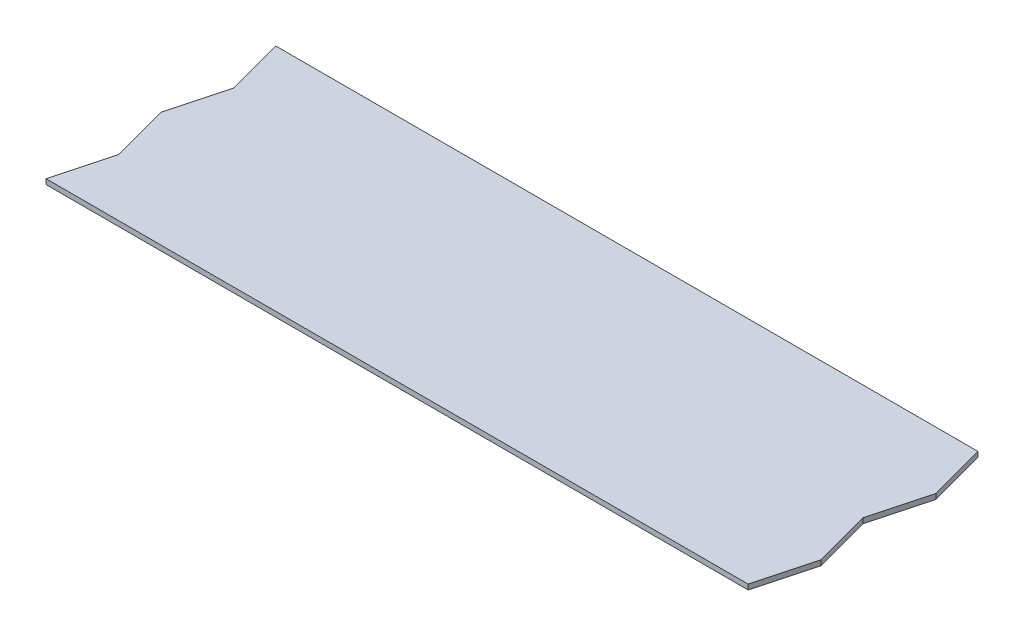
ISO-10303-21;
HEADER;
FILE_DESCRIPTION(('STEP AP214'),'2;1');
FILE_NAME('part.step','',(''),(''),'','','');
FILE_SCHEMA(('AUTOMOTIVE_DESIGN { 1 0 10303 214 1 1 1 1 }'));
ENDSEC;
DATA;
#1=APPLICATION_CONTEXT('core data for automotive mechanical design processes');
#2=APPLICATION_PROTOCOL_DEFINITION('international standard','automotive_design',2000,#1);
#3=PRODUCT_CONTEXT('',#1,'mechanical');
#4=PRODUCT('Part','Part','',(#3));
#5=PRODUCT_RELATED_PRODUCT_CATEGORY('part','',(#4));
#6=PRODUCT_DEFINITION_FORMATION('','',#4);
#7=PRODUCT_DEFINITION_CONTEXT('part definition',#1,'design');
#8=PRODUCT_DEFINITION('design','',#6,#7);
#9=PRODUCT_DEFINITION_SHAPE('','',#8);
#10=(LENGTH_UNIT() NAMED_UNIT(*) SI_UNIT(.MILLI.,.METRE.));
#11=(NAMED_UNIT(*) PLANE_ANGLE_UNIT() SI_UNIT($,.RADIAN.));
#12=(NAMED_UNIT(*) SI_UNIT($,.STERADIAN.) SOLID_ANGLE_UNIT());
#13=UNCERTAINTY_MEASURE_WITH_UNIT(LENGTH_MEASURE(1.E-05),#10,'distance_accuracy_value','');
#14=(GEOMETRIC_REPRESENTATION_CONTEXT(3) GLOBAL_UNCERTAINTY_ASSIGNED_CONTEXT((#13)) GLOBAL_UNIT_ASSIGNED_CONTEXT((#10,
#11,#12)) REPRESENTATION_CONTEXT('',''));
#15=CARTESIAN_POINT('',(0.,0.,0.));
#16=DIRECTION('',(0.,0.,1.));
#17=DIRECTION('',(1.,0.,0.));
#18=AXIS2_PLACEMENT_3D('',#15,#16,#17);
#19=CARTESIAN_POINT('',(0.,0.4,0.));
#20=DIRECTION('',(0.965925826289072,0.,-0.258819045102506));
#21=DIRECTION('',(-0.258819045102506,0.,-0.965925826289072));
#22=AXIS2_PLACEMENT_3D('',#19,#20,#21);
#23=PLANE('',#22);
#24=DIRECTION('',(0.258819045102506,0.,0.965925826289072));
#25=VECTOR('',#24,1.);
#26=CARTESIAN_POINT('',(0.,0.,0.));
#27=LINE('',#26,#25);
#28=CARTESIAN_POINT('',(0.,0.,0.));
#29=VERTEX_POINT('',#28);
#30=CARTESIAN_POINT('',(1.20577136593996,0.,4.49999999999992));
#31=VERTEX_POINT('',#30);
#32=EDGE_CURVE('E147',#29,#31,#27,.T.);
#33=ORIENTED_EDGE('',*,*,#32,.T.);
#34=DIRECTION('',(0.,-1.,0.));
#35=VECTOR('',#34,1.);
#36=CARTESIAN_POINT('',(1.20577136593996,0.4,4.49999999999992));
#37=LINE('',#36,#35);
#38=CARTESIAN_POINT('',(1.20577136593996,0.4,4.49999999999992));
#39=VERTEX_POINT('',#38);
#40=EDGE_CURVE('E11',#39,#31,#37,.T.);
#41=ORIENTED_EDGE('',*,*,#40,.F.);
#42=DIRECTION('',(0.258819045102506,0.,0.965925826289072));
#43=VECTOR('',#42,1.);
#44=CARTESIAN_POINT('',(0.,0.4,0.));
#45=LINE('',#44,#43);
#46=CARTESIAN_POINT('',(0.,0.4,0.));
#47=VERTEX_POINT('',#46);
#48=EDGE_CURVE('E165',#47,#39,#45,.T.);
#49=ORIENTED_EDGE('',*,*,#48,.F.);
#50=DIRECTION('',(0.,-1.,0.));
#51=VECTOR('',#50,1.);
#52=CARTESIAN_POINT('',(0.,0.4,0.));
#53=LINE('',#52,#51);
#54=EDGE_CURVE('E143',#47,#29,#53,.T.);
#55=ORIENTED_EDGE('',*,*,#54,.T.);
#56=EDGE_LOOP('',(#33,#41,#49,#55));
#57=FACE_BOUND('',#56,.T.);
#58=ADVANCED_FACE('F39',(#57),#23,.F.);
#59=CARTESIAN_POINT('',(1.20577136593996,0.4,4.49999999999992));
#60=DIRECTION('',(0.965925826289067,0.,0.258819045102525));
#61=DIRECTION('',(0.258819045102525,0.,-0.965925826289067));
#62=AXIS2_PLACEMENT_3D('',#59,#60,#61);
#63=PLANE('',#62);
#64=DIRECTION('',(-0.258819045102525,0.,0.965925826289067));
#65=VECTOR('',#64,1.);
#66=CARTESIAN_POINT('',(1.20577136593996,0.,4.49999999999992));
#67=LINE('',#66,#65);
#68=CARTESIAN_POINT('',(0.,0.,8.99999999999982));
#69=VERTEX_POINT('',#68);
#70=EDGE_CURVE('E150',#31,#69,#67,.T.);
#71=ORIENTED_EDGE('',*,*,#70,.T.);
#72=DIRECTION('',(0.,-1.,0.));
#73=VECTOR('',#72,1.);
#74=CARTESIAN_POINT('',(0.,0.4,8.99999999999982));
#75=LINE('',#74,#73);
#76=CARTESIAN_POINT('',(0.,0.4,8.99999999999982));
#77=VERTEX_POINT('',#76);
#78=EDGE_CURVE('E47',#77,#69,#75,.T.);
#79=ORIENTED_EDGE('',*,*,#78,.F.);
#80=DIRECTION('',(-0.258819045102525,0.,0.965925826289067));
#81=VECTOR('',#80,1.);
#82=CARTESIAN_POINT('',(1.20577136593996,0.4,4.49999999999992));
#83=LINE('',#82,#81);
#84=EDGE_CURVE('E104',#39,#77,#83,.T.);
#85=ORIENTED_EDGE('',*,*,#84,.F.);
#86=ORIENTED_EDGE('',*,*,#40,.T.);
#87=EDGE_LOOP('',(#71,#79,#85,#86));
#88=FACE_BOUND('',#87,.T.);
#89=ADVANCED_FACE('F214',(#88),#63,.F.);
#90=CARTESIAN_POINT('',(0.,0.4,8.99999999999982));
#91=DIRECTION('',(0.965925826289071,0.,-0.258819045102511));
#92=DIRECTION('',(-0.258819045102511,0.,-0.965925826289071));
#93=AXIS2_PLACEMENT_3D('',#90,#91,#92);
#94=PLANE('',#93);
#95=DIRECTION('',(0.258819045102511,0.,0.965925826289071));
#96=VECTOR('',#95,1.);
#97=CARTESIAN_POINT('',(0.,0.,8.99999999999982));
#98=LINE('',#97,#96);
#99=CARTESIAN_POINT('',(1.20577136593999,0.,13.5000000000001));
#100=VERTEX_POINT('',#99);
#101=EDGE_CURVE('E152',#69,#100,#98,.T.);
#102=ORIENTED_EDGE('',*,*,#101,.T.);
#103=DIRECTION('',(0.,-1.,0.));
#104=VECTOR('',#103,1.);
#105=CARTESIAN_POINT('',(1.20577136593999,0.4,13.5000000000001));
#106=LINE('',#105,#104);
#107=CARTESIAN_POINT('',(1.20577136593999,0.4,13.5000000000001));
#108=VERTEX_POINT('',#107);
#109=EDGE_CURVE('E178',#108,#100,#106,.T.);
#110=ORIENTED_EDGE('',*,*,#109,.F.);
#111=DIRECTION('',(0.258819045102511,0.,0.965925826289071));
#112=VECTOR('',#111,1.);
#113=CARTESIAN_POINT('',(0.,0.4,8.99999999999982));
#114=LINE('',#113,#112);
#115=EDGE_CURVE('E186',#77,#108,#114,.T.);
#116=ORIENTED_EDGE('',*,*,#115,.F.);
#117=ORIENTED_EDGE('',*,*,#78,.T.);
#118=EDGE_LOOP('',(#102,#110,#116,#117));
#119=FACE_BOUND('',#118,.T.);
#120=ADVANCED_FACE('F184',(#119),#94,.F.);
#121=CARTESIAN_POINT('',(1.20577136593999,0.4,13.5000000000001));
#122=DIRECTION('',(0.965925826289066,0.,0.258819045102531));
#123=DIRECTION('',(0.258819045102531,0.,-0.965925826289066));
#124=AXIS2_PLACEMENT_3D('',#121,#122,#123);
#125=PLANE('',#124);
#126=DIRECTION('',(-0.258819045102531,0.,0.965925826289066));
#127=VECTOR('',#126,1.);
#128=CARTESIAN_POINT('',(1.20577136593999,0.,13.5000000000001));
#129=LINE('',#128,#127);
#130=CARTESIAN_POINT('',(0.,0.,18.));
#131=VERTEX_POINT('',#130);
#132=EDGE_CURVE('E154',#100,#131,#129,.T.);
#133=ORIENTED_EDGE('',*,*,#132,.T.);
#134=DIRECTION('',(0.,-1.,0.));
#135=VECTOR('',#134,1.);
#136=CARTESIAN_POINT('',(0.,0.4,18.));
#137=LINE('',#136,#135);
#138=CARTESIAN_POINT('',(0.,0.4,18.));
#139=VERTEX_POINT('',#138);
#140=EDGE_CURVE('E175',#139,#131,#137,.T.);
#141=ORIENTED_EDGE('',*,*,#140,.F.);
#142=DIRECTION('',(-0.258819045102531,0.,0.965925826289066));
#143=VECTOR('',#142,1.);
#144=CARTESIAN_POINT('',(1.20577136593999,0.4,13.5000000000001));
#145=LINE('',#144,#143);
#146=EDGE_CURVE('E204',#108,#139,#145,.T.);
#147=ORIENTED_EDGE('',*,*,#146,.F.);
#148=ORIENTED_EDGE('',*,*,#109,.T.);
#149=EDGE_LOOP('',(#133,#141,#147,#148));
#150=FACE_BOUND('',#149,.T.);
#151=ADVANCED_FACE('F195',(#150),#125,.F.);
#152=CARTESIAN_POINT('',(55.,0.4,18.0000000000002));
#153=DIRECTION('',(0.,0.,-1.));
#154=DIRECTION('',(-1.,0.,0.));
#155=AXIS2_PLACEMENT_3D('',#152,#153,#154);
#156=PLANE('',#155);
#157=DIRECTION('',(1.,0.,0.));
#158=VECTOR('',#157,1.);
#159=CARTESIAN_POINT('',(55.,0.,18.0000000000002));
#160=LINE('',#159,#158);
#161=CARTESIAN_POINT('',(55.,0.,18.0000000000002));
#162=VERTEX_POINT('',#161);
#163=EDGE_CURVE('E156',#131,#162,#160,.T.);
#164=ORIENTED_EDGE('',*,*,#163,.T.);
#165=DIRECTION('',(0.,-1.,0.));
#166=VECTOR('',#165,1.);
#167=CARTESIAN_POINT('',(55.,0.4,18.0000000000002));
#168=LINE('',#167,#166);
#169=CARTESIAN_POINT('',(55.,0.4,18.0000000000002));
#170=VERTEX_POINT('',#169);
#171=EDGE_CURVE('E172',#170,#162,#168,.T.);
#172=ORIENTED_EDGE('',*,*,#171,.F.);
#173=DIRECTION('',(1.,0.,0.));
#174=VECTOR('',#173,1.);
#175=CARTESIAN_POINT('',(55.,0.4,18.0000000000002));
#176=LINE('',#175,#174);
#177=EDGE_CURVE('E201',#139,#170,#176,.T.);
#178=ORIENTED_EDGE('',*,*,#177,.F.);
#179=ORIENTED_EDGE('',*,*,#140,.T.);
#180=EDGE_LOOP('',(#164,#172,#178,#179));
#181=FACE_BOUND('',#180,.T.);
#182=ADVANCED_FACE('F199',(#181),#156,.F.);
#183=CARTESIAN_POINT('',(56.20577136594,0.4,13.5000000000001));
#184=DIRECTION('',(-0.965925826289073,0.,-0.258819045102503));
#185=DIRECTION('',(-0.258819045102503,0.,0.965925826289073));
#186=AXIS2_PLACEMENT_3D('',#183,#184,#185);
#187=PLANE('',#186);
#188=DIRECTION('',(0.258819045102503,0.,-0.965925826289073));
#189=VECTOR('',#188,1.);
#190=CARTESIAN_POINT('',(56.20577136594,0.,13.5000000000001));
#191=LINE('',#190,#189);
#192=CARTESIAN_POINT('',(56.20577136594,0.,13.5000000000001));
#193=VERTEX_POINT('',#192);
#194=EDGE_CURVE('E158',#162,#193,#191,.T.);
#195=ORIENTED_EDGE('',*,*,#194,.T.);
#196=DIRECTION('',(0.,-1.,0.));
#197=VECTOR('',#196,1.);
#198=CARTESIAN_POINT('',(56.20577136594,0.4,13.5000000000001));
#199=LINE('',#198,#197);
#200=CARTESIAN_POINT('',(56.20577136594,0.4,13.5000000000001));
#201=VERTEX_POINT('',#200);
#202=EDGE_CURVE('E169',#201,#193,#199,.T.);
#203=ORIENTED_EDGE('',*,*,#202,.F.);
#204=DIRECTION('',(0.258819045102503,0.,-0.965925826289073));
#205=VECTOR('',#204,1.);
#206=CARTESIAN_POINT('',(56.20577136594,0.4,13.5000000000001));
#207=LINE('',#206,#205);
#208=EDGE_CURVE('E203',#170,#201,#207,.T.);
#209=ORIENTED_EDGE('',*,*,#208,.F.);
#210=ORIENTED_EDGE('',*,*,#171,.T.);
#211=EDGE_LOOP('',(#195,#203,#209,#210));
#212=FACE_BOUND('',#211,.T.);
#213=ADVANCED_FACE('F226',(#212),#187,.F.);
#214=CARTESIAN_POINT('',(55.,0.4,8.99999999999998));
#215=DIRECTION('',(-0.965925826289072,0.,0.258819045102508));
#216=DIRECTION('',(0.258819045102508,0.,0.965925826289072));
#217=AXIS2_PLACEMENT_3D('',#214,#215,#216);
#218=PLANE('',#217);
#219=DIRECTION('',(-0.258819045102508,0.,-0.965925826289072));
#220=VECTOR('',#219,1.);
#221=CARTESIAN_POINT('',(55.,0.,8.99999999999998));
#222=LINE('',#221,#220);
#223=CARTESIAN_POINT('',(55.,0.,8.99999999999998));
#224=VERTEX_POINT('',#223);
#225=EDGE_CURVE('E160',#193,#224,#222,.T.);
#226=ORIENTED_EDGE('',*,*,#225,.T.);
#227=DIRECTION('',(0.,-1.,0.));
#228=VECTOR('',#227,1.);
#229=CARTESIAN_POINT('',(55.,0.4,8.99999999999998));
#230=LINE('',#229,#228);
#231=CARTESIAN_POINT('',(55.,0.4,8.99999999999998));
#232=VERTEX_POINT('',#231);
#233=EDGE_CURVE('E138',#232,#224,#230,.T.);
#234=ORIENTED_EDGE('',*,*,#233,.F.);
#235=DIRECTION('',(-0.258819045102508,0.,-0.965925826289072));
#236=VECTOR('',#235,1.);
#237=CARTESIAN_POINT('',(55.,0.4,8.99999999999998));
#238=LINE('',#237,#236);
#239=EDGE_CURVE('E129',#201,#232,#238,.T.);
#240=ORIENTED_EDGE('',*,*,#239,.F.);
#241=ORIENTED_EDGE('',*,*,#202,.T.);
#242=EDGE_LOOP('',(#226,#234,#240,#241));
#243=FACE_BOUND('',#242,.T.);
#244=ADVANCED_FACE('F229',(#243),#218,.F.);
#245=CARTESIAN_POINT('',(56.20577136594,0.4,4.49999999999999));
#246=DIRECTION('',(-0.965925826289067,0.,-0.258819045102525));
#247=DIRECTION('',(-0.258819045102525,0.,0.965925826289067));
#248=AXIS2_PLACEMENT_3D('',#245,#246,#247);
#249=PLANE('',#248);
#250=DIRECTION('',(0.258819045102525,0.,-0.965925826289067));
#251=VECTOR('',#250,1.);
#252=CARTESIAN_POINT('',(56.20577136594,0.,4.49999999999999));
#253=LINE('',#252,#251);
#254=CARTESIAN_POINT('',(56.20577136594,0.,4.49999999999999));
#255=VERTEX_POINT('',#254);
#256=EDGE_CURVE('E137',#224,#255,#253,.T.);
#257=ORIENTED_EDGE('',*,*,#256,.T.);
#258=DIRECTION('',(0.,-1.,0.));
#259=VECTOR('',#258,1.);
#260=CARTESIAN_POINT('',(56.20577136594,0.4,4.49999999999999));
#261=LINE('',#260,#259);
#262=CARTESIAN_POINT('',(56.20577136594,0.4,4.49999999999999));
#263=VERTEX_POINT('',#262);
#264=EDGE_CURVE('E134',#263,#255,#261,.T.);
#265=ORIENTED_EDGE('',*,*,#264,.F.);
#266=DIRECTION('',(0.258819045102525,0.,-0.965925826289067));
#267=VECTOR('',#266,1.);
#268=CARTESIAN_POINT('',(56.20577136594,0.4,4.49999999999999));
#269=LINE('',#268,#267);
#270=EDGE_CURVE('E123',#232,#263,#269,.T.);
#271=ORIENTED_EDGE('',*,*,#270,.F.);
#272=ORIENTED_EDGE('',*,*,#233,.T.);
#273=EDGE_LOOP('',(#257,#265,#271,#272));
#274=FACE_BOUND('',#273,.T.);
#275=ADVANCED_FACE('F135',(#274),#249,.F.);
#276=CARTESIAN_POINT('',(55.,0.4,0.));
#277=DIRECTION('',(-0.965925826289069,0.,0.258819045102518));
#278=DIRECTION('',(0.258819045102518,0.,0.965925826289069));
#279=AXIS2_PLACEMENT_3D('',#276,#277,#278);
#280=PLANE('',#279);
#281=DIRECTION('',(-0.258819045102518,0.,-0.965925826289069));
#282=VECTOR('',#281,1.);
#283=CARTESIAN_POINT('',(55.,0.,0.));
#284=LINE('',#283,#282);
#285=CARTESIAN_POINT('',(55.,0.,0.));
#286=VERTEX_POINT('',#285);
#287=EDGE_CURVE('E90',#255,#286,#284,.T.);
#288=ORIENTED_EDGE('',*,*,#287,.T.);
#289=DIRECTION('',(0.,-1.,0.));
#290=VECTOR('',#289,1.);
#291=CARTESIAN_POINT('',(55.,0.4,0.));
#292=LINE('',#291,#290);
#293=CARTESIAN_POINT('',(55.,0.4,0.));
#294=VERTEX_POINT('',#293);
#295=EDGE_CURVE('E139',#294,#286,#292,.T.);
#296=ORIENTED_EDGE('',*,*,#295,.F.);
#297=DIRECTION('',(-0.258819045102518,0.,-0.965925826289069));
#298=VECTOR('',#297,1.);
#299=CARTESIAN_POINT('',(55.,0.4,0.));
#300=LINE('',#299,#298);
#301=EDGE_CURVE('E127',#263,#294,#300,.T.);
#302=ORIENTED_EDGE('',*,*,#301,.F.);
#303=ORIENTED_EDGE('',*,*,#264,.T.);
#304=EDGE_LOOP('',(#288,#296,#302,#303));
#305=FACE_BOUND('',#304,.T.);
#306=ADVANCED_FACE('F141',(#305),#280,.F.);
#307=CARTESIAN_POINT('',(0.,0.4,0.));
#308=DIRECTION('',(0.,0.,1.));
#309=DIRECTION('',(1.,0.,0.));
#310=AXIS2_PLACEMENT_3D('',#307,#308,#309);
#311=PLANE('',#310);
#312=DIRECTION('',(-1.,0.,0.));
#313=VECTOR('',#312,1.);
#314=CARTESIAN_POINT('',(0.,0.,0.));
#315=LINE('',#314,#313);
#316=EDGE_CURVE('E96',#286,#29,#315,.T.);
#317=ORIENTED_EDGE('',*,*,#316,.T.);
#318=ORIENTED_EDGE('',*,*,#54,.F.);
#319=DIRECTION('',(-1.,0.,0.));
#320=VECTOR('',#319,1.);
#321=CARTESIAN_POINT('',(0.,0.4,0.));
#322=LINE('',#321,#320);
#323=EDGE_CURVE('E55',#294,#47,#322,.T.);
#324=ORIENTED_EDGE('',*,*,#323,.F.);
#325=ORIENTED_EDGE('',*,*,#295,.T.);
#326=EDGE_LOOP('',(#317,#318,#324,#325));
#327=FACE_BOUND('',#326,.T.);
#328=ADVANCED_FACE('F238',(#327),#311,.F.);
#329=CARTESIAN_POINT('',(0.,0.4,0.));
#330=DIRECTION('',(0.,-1.,0.));
#331=DIRECTION('',(0.,0.,-1.));
#332=AXIS2_PLACEMENT_3D('',#329,#330,#331);
#333=PLANE('',#332);
#334=ORIENTED_EDGE('',*,*,#48,.T.);
#335=ORIENTED_EDGE('',*,*,#84,.T.);
#336=ORIENTED_EDGE('',*,*,#115,.T.);
#337=ORIENTED_EDGE('',*,*,#146,.T.);
#338=ORIENTED_EDGE('',*,*,#177,.T.);
#339=ORIENTED_EDGE('',*,*,#208,.T.);
#340=ORIENTED_EDGE('',*,*,#239,.T.);
#341=ORIENTED_EDGE('',*,*,#270,.T.);
#342=ORIENTED_EDGE('',*,*,#301,.T.);
#343=ORIENTED_EDGE('',*,*,#323,.T.);
#344=EDGE_LOOP('',(#334,#335,#336,#337,#338,#339,#340,#341,#342,#343));
#345=FACE_BOUND('',#344,.T.);
#346=ADVANCED_FACE('F125',(#345),#333,.F.);
#347=CARTESIAN_POINT('',(0.,0.,0.));
#348=DIRECTION('',(0.,-1.,0.));
#349=DIRECTION('',(0.,0.,-1.));
#350=AXIS2_PLACEMENT_3D('',#347,#348,#349);
#351=PLANE('',#350);
#352=ORIENTED_EDGE('',*,*,#32,.F.);
#353=ORIENTED_EDGE('',*,*,#316,.F.);
#354=ORIENTED_EDGE('',*,*,#287,.F.);
#355=ORIENTED_EDGE('',*,*,#256,.F.);
#356=ORIENTED_EDGE('',*,*,#225,.F.);
#357=ORIENTED_EDGE('',*,*,#194,.F.);
#358=ORIENTED_EDGE('',*,*,#163,.F.);
#359=ORIENTED_EDGE('',*,*,#132,.F.);
#360=ORIENTED_EDGE('',*,*,#101,.F.);
#361=ORIENTED_EDGE('',*,*,#70,.F.);
#362=EDGE_LOOP('',(#352,#353,#354,#355,#356,#357,#358,#359,#360,#361));
#363=FACE_BOUND('',#362,.T.);
#364=ADVANCED_FACE('F190',(#363),#351,.T.);
#365=CLOSED_SHELL('',(#58,#89,#120,#151,#182,#213,#244,#275,#306,#328,#346,#364));
#366=MANIFOLD_SOLID_BREP('B2',#365);
#367=ADVANCED_BREP_SHAPE_REPRESENTATION('',(#18,#366),#14);
#368=SHAPE_DEFINITION_REPRESENTATION(#9,#367);
ENDSEC;
END-ISO-10303-21;
